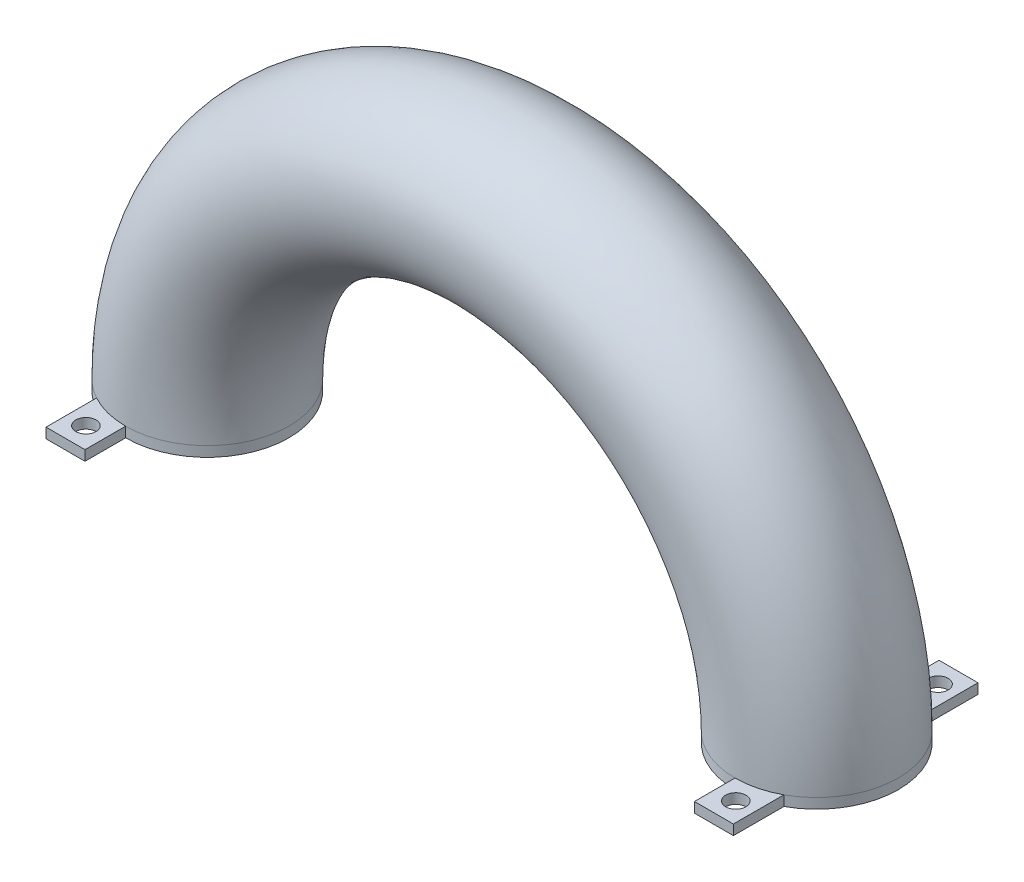
ISO-10303-21;
HEADER;
FILE_DESCRIPTION(('STEP AP214'),'2;1');
FILE_NAME('part.step','',(''),(''),'','','');
FILE_SCHEMA(('AUTOMOTIVE_DESIGN { 1 0 10303 214 1 1 1 1 }'));
ENDSEC;
DATA;
#1=APPLICATION_CONTEXT('core data for automotive mechanical design processes');
#2=APPLICATION_PROTOCOL_DEFINITION('international standard','automotive_design',2000,#1);
#3=PRODUCT_CONTEXT('',#1,'mechanical');
#4=PRODUCT('Part','Part','',(#3));
#5=PRODUCT_RELATED_PRODUCT_CATEGORY('part','',(#4));
#6=PRODUCT_DEFINITION_FORMATION('','',#4);
#7=PRODUCT_DEFINITION_CONTEXT('part definition',#1,'design');
#8=PRODUCT_DEFINITION('design','',#6,#7);
#9=PRODUCT_DEFINITION_SHAPE('','',#8);
#10=(LENGTH_UNIT() NAMED_UNIT(*) SI_UNIT(.MILLI.,.METRE.));
#11=(NAMED_UNIT(*) PLANE_ANGLE_UNIT() SI_UNIT($,.RADIAN.));
#12=(NAMED_UNIT(*) SI_UNIT($,.STERADIAN.) SOLID_ANGLE_UNIT());
#13=UNCERTAINTY_MEASURE_WITH_UNIT(LENGTH_MEASURE(1.E-05),#10,'distance_accuracy_value','');
#14=(GEOMETRIC_REPRESENTATION_CONTEXT(3) GLOBAL_UNCERTAINTY_ASSIGNED_CONTEXT((#13)) GLOBAL_UNIT_ASSIGNED_CONTEXT((#10,
#11,#12)) REPRESENTATION_CONTEXT('',''));
#15=CARTESIAN_POINT('',(0.,0.,0.));
#16=DIRECTION('',(0.,0.,1.));
#17=DIRECTION('',(1.,0.,0.));
#18=AXIS2_PLACEMENT_3D('',#15,#16,#17);
#19=CARTESIAN_POINT('',(0.,0.,0.));
#20=DIRECTION('',(0.,0.,1.));
#21=DIRECTION('',(1.,0.,0.));
#22=AXIS2_PLACEMENT_3D('',#19,#20,#21);
#23=TOROIDAL_SURFACE('',#22,60.25,16.15);
#24=CARTESIAN_POINT('',(-60.25,0.,0.));
#25=DIRECTION('',(0.,-1.,0.));
#26=DIRECTION('',(0.,0.,1.));
#27=AXIS2_PLACEMENT_3D('',#24,#25,#26);
#28=CIRCLE('',#27,16.15);
#29=CARTESIAN_POINT('',(-60.25,0.,16.15));
#30=VERTEX_POINT('',#29);
#31=CARTESIAN_POINT('',(-67.9596595843117,0.,14.1909706889286));
#32=VERTEX_POINT('',#31);
#33=EDGE_CURVE('E253',#30,#32,#28,.T.);
#34=ORIENTED_EDGE('',*,*,#33,.F.);
#35=CARTESIAN_POINT('',(-60.25,0.,0.));
#36=DIRECTION('',(0.,-1.,0.));
#37=DIRECTION('',(1.,0.,0.));
#38=AXIS2_PLACEMENT_3D('',#35,#36,#37);
#39=CIRCLE('',#38,16.15);
#40=CARTESIAN_POINT('',(-60.25,0.,-16.15));
#41=VERTEX_POINT('',#40);
#42=EDGE_CURVE('E131',#41,#30,#39,.T.);
#43=ORIENTED_EDGE('',*,*,#42,.F.);
#44=CARTESIAN_POINT('',(-60.25,0.,0.));
#45=DIRECTION('',(0.,-1.,0.));
#46=DIRECTION('',(1.,0.,0.));
#47=AXIS2_PLACEMENT_3D('',#44,#45,#46);
#48=CIRCLE('',#47,16.15);
#49=CARTESIAN_POINT('',(-67.9596595843117,0.,-14.1909706889286));
#50=VERTEX_POINT('',#49);
#51=EDGE_CURVE('E254',#41,#50,#48,.F.);
#52=ORIENTED_EDGE('',*,*,#51,.T.);
#53=EDGE_CURVE('E263',#32,#50,#39,.T.);
#54=ORIENTED_EDGE('',*,*,#53,.F.);
#55=EDGE_LOOP('',(#34,#43,#52,#54));
#56=FACE_BOUND('',#55,.T.);
#57=CARTESIAN_POINT('',(60.25,0.,0.));
#58=DIRECTION('',(0.,1.,0.));
#59=DIRECTION('',(0.,0.,1.));
#60=AXIS2_PLACEMENT_3D('',#57,#58,#59);
#61=CIRCLE('',#60,16.15);
#62=CARTESIAN_POINT('',(60.25,0.,16.15));
#63=VERTEX_POINT('',#62);
#64=CARTESIAN_POINT('',(67.9596595843117,0.,14.1909706889286));
#65=VERTEX_POINT('',#64);
#66=EDGE_CURVE('E110',#63,#65,#61,.T.);
#67=ORIENTED_EDGE('',*,*,#66,.T.);
#68=CARTESIAN_POINT('',(60.25,0.,0.));
#69=DIRECTION('',(0.,1.,0.));
#70=DIRECTION('',(-1.,0.,0.));
#71=AXIS2_PLACEMENT_3D('',#68,#69,#70);
#72=CIRCLE('',#71,16.15);
#73=CARTESIAN_POINT('',(67.9596595843117,0.,-14.1909706889286));
#74=VERTEX_POINT('',#73);
#75=EDGE_CURVE('E244',#65,#74,#72,.T.);
#76=ORIENTED_EDGE('',*,*,#75,.T.);
#77=CARTESIAN_POINT('',(60.25,0.,0.));
#78=DIRECTION('',(0.,-1.,0.));
#79=DIRECTION('',(1.,0.,0.));
#80=AXIS2_PLACEMENT_3D('',#77,#78,#79);
#81=CIRCLE('',#80,16.15);
#82=CARTESIAN_POINT('',(60.25,0.,-16.15));
#83=VERTEX_POINT('',#82);
#84=EDGE_CURVE('E425',#74,#83,#81,.F.);
#85=ORIENTED_EDGE('',*,*,#84,.T.);
#86=EDGE_CURVE('E249',#83,#63,#72,.T.);
#87=ORIENTED_EDGE('',*,*,#86,.T.);
#88=EDGE_LOOP('',(#67,#76,#85,#87));
#89=FACE_BOUND('',#88,.T.);
#90=ADVANCED_FACE('F107',(#56,#89),#23,.T.);
#91=CARTESIAN_POINT('',(0.,0.,0.));
#92=DIRECTION('',(0.,0.,1.));
#93=DIRECTION('',(1.,0.,0.));
#94=AXIS2_PLACEMENT_3D('',#91,#92,#93);
#95=TOROIDAL_SURFACE('',#94,60.25,14.15);
#96=CARTESIAN_POINT('',(60.25,0.,0.));
#97=DIRECTION('',(0.,1.,0.));
#98=DIRECTION('',(0.,0.,1.));
#99=AXIS2_PLACEMENT_3D('',#96,#97,#98);
#100=CIRCLE('',#99,14.15);
#101=CARTESIAN_POINT('',(74.4,0.,0.));
#102=VERTEX_POINT('',#101);
#103=EDGE_CURVE('E115',#102,#102,#100,.F.);
#104=CARTESIAN_POINT('',(-60.25,0.,0.));
#105=DIRECTION('',(0.,-1.,0.));
#106=DIRECTION('',(0.,0.,1.));
#107=AXIS2_PLACEMENT_3D('',#104,#105,#106);
#108=CIRCLE('',#107,14.15);
#109=CARTESIAN_POINT('',(-74.4,0.,0.));
#110=VERTEX_POINT('',#109);
#111=EDGE_CURVE('E12',#110,#110,#108,.F.);
#112=CARTESIAN_POINT('',(0.,0.,0.));
#113=DIRECTION('',(0.,0.,1.));
#114=DIRECTION('',(1.,0.,0.));
#115=AXIS2_PLACEMENT_3D('',#112,#113,#114);
#116=CIRCLE('',#115,74.4);
#117=EDGE_CURVE('',#102,#110,#116,.T.);
#118=ORIENTED_EDGE('',*,*,#103,.T.);
#119=ORIENTED_EDGE('',*,*,#111,.F.);
#120=ORIENTED_EDGE('',*,*,#117,.T.);
#121=ORIENTED_EDGE('',*,*,#117,.F.);
#122=EDGE_LOOP('',(#118,#120,#119,#121));
#123=FACE_BOUND('',#122,.T.);
#124=ADVANCED_FACE('F268',(#123),#95,.F.);
#125=CARTESIAN_POINT('',(0.,0.,0.));
#126=DIRECTION('',(0.,-1.,0.));
#127=DIRECTION('',(1.,0.,0.));
#128=AXIS2_PLACEMENT_3D('',#125,#126,#127);
#129=PLANE('',#128);
#130=ORIENTED_EDGE('',*,*,#51,.F.);
#131=DIRECTION('',(0.,0.,-1.));
#132=VECTOR('',#131,1.);
#133=CARTESIAN_POINT('',(-60.25,0.,0.));
#134=LINE('',#133,#132);
#135=CARTESIAN_POINT('',(-60.25,0.,-24.1836955760806));
#136=VERTEX_POINT('',#135);
#137=EDGE_CURVE('E432',#41,#136,#134,.T.);
#138=ORIENTED_EDGE('',*,*,#137,.T.);
#139=DIRECTION('',(-1.,0.,0.));
#140=VECTOR('',#139,1.);
#141=CARTESIAN_POINT('',(0.,0.,-24.1836955760806));
#142=LINE('',#141,#140);
#143=CARTESIAN_POINT('',(-67.9596595843117,0.,-24.1836955760806));
#144=VERTEX_POINT('',#143);
#145=EDGE_CURVE('E448',#136,#144,#142,.T.);
#146=ORIENTED_EDGE('',*,*,#145,.T.);
#147=DIRECTION('',(0.,0.,-1.));
#148=VECTOR('',#147,1.);
#149=CARTESIAN_POINT('',(-67.9596595843117,0.,0.));
#150=LINE('',#149,#148);
#151=EDGE_CURVE('E444',#50,#144,#150,.T.);
#152=ORIENTED_EDGE('',*,*,#151,.F.);
#153=EDGE_LOOP('',(#130,#138,#146,#152));
#154=FACE_BOUND('',#153,.T.);
#155=CARTESIAN_POINT('',(-64.25,0.,-20.));
#156=DIRECTION('',(0.,-1.,0.));
#157=DIRECTION('',(1.,0.,0.));
#158=AXIS2_PLACEMENT_3D('',#155,#156,#157);
#159=CIRCLE('',#158,2.);
#160=CARTESIAN_POINT('',(-62.25,0.,-20.));
#161=VERTEX_POINT('',#160);
#162=EDGE_CURVE('E441',#161,#161,#159,.T.);
#163=ORIENTED_EDGE('',*,*,#162,.T.);
#164=EDGE_LOOP('',(#163));
#165=FACE_BOUND('',#164,.T.);
#166=ADVANCED_FACE('F282',(#154,#165),#129,.F.);
#167=CARTESIAN_POINT('',(-67.9596595843117,-2.,0.));
#168=DIRECTION('',(1.,0.,0.));
#169=DIRECTION('',(0.,1.,0.));
#170=AXIS2_PLACEMENT_3D('',#167,#168,#169);
#171=PLANE('',#170);
#172=ORIENTED_EDGE('',*,*,#151,.T.);
#173=DIRECTION('',(0.,1.,0.));
#174=VECTOR('',#173,1.);
#175=CARTESIAN_POINT('',(-67.9596595843117,-2.,-24.1836955760806));
#176=LINE('',#175,#174);
#177=CARTESIAN_POINT('',(-67.9596595843117,-2.,-24.1836955760806));
#178=VERTEX_POINT('',#177);
#179=EDGE_CURVE('E259',#178,#144,#176,.T.);
#180=ORIENTED_EDGE('',*,*,#179,.F.);
#181=DIRECTION('',(0.,0.,-1.));
#182=VECTOR('',#181,1.);
#183=CARTESIAN_POINT('',(-67.9596595843117,-2.,0.));
#184=LINE('',#183,#182);
#185=CARTESIAN_POINT('',(-67.9596595843117,-2.,-14.1909706889286));
#186=VERTEX_POINT('',#185);
#187=EDGE_CURVE('E431',#186,#178,#184,.T.);
#188=ORIENTED_EDGE('',*,*,#187,.F.);
#189=DIRECTION('',(0.,1.,0.));
#190=VECTOR('',#189,1.);
#191=CARTESIAN_POINT('',(-67.9596595843117,-2.,-14.1909706889286));
#192=LINE('',#191,#190);
#193=EDGE_CURVE('E256',#186,#50,#192,.T.);
#194=ORIENTED_EDGE('',*,*,#193,.T.);
#195=EDGE_LOOP('',(#172,#180,#188,#194));
#196=FACE_BOUND('',#195,.T.);
#197=ADVANCED_FACE('F288',(#196),#171,.F.);
#198=CARTESIAN_POINT('',(0.,-2.00000000000001,-24.1836955760806));
#199=DIRECTION('',(0.,0.,-1.));
#200=DIRECTION('',(-1.,0.,0.));
#201=AXIS2_PLACEMENT_3D('',#198,#199,#200);
#202=PLANE('',#201);
#203=ORIENTED_EDGE('',*,*,#145,.F.);
#204=DIRECTION('',(0.,1.,0.));
#205=VECTOR('',#204,1.);
#206=CARTESIAN_POINT('',(-60.25,-2.,-24.1836955760806));
#207=LINE('',#206,#205);
#208=CARTESIAN_POINT('',(-60.25,-2.,-24.1836955760806));
#209=VERTEX_POINT('',#208);
#210=EDGE_CURVE('E455',#209,#136,#207,.T.);
#211=ORIENTED_EDGE('',*,*,#210,.F.);
#212=DIRECTION('',(-1.,0.,0.));
#213=VECTOR('',#212,1.);
#214=CARTESIAN_POINT('',(0.,-2.00000000000001,-24.1836955760806));
#215=LINE('',#214,#213);
#216=EDGE_CURVE('E434',#209,#178,#215,.T.);
#217=ORIENTED_EDGE('',*,*,#216,.T.);
#218=ORIENTED_EDGE('',*,*,#179,.T.);
#219=EDGE_LOOP('',(#203,#211,#217,#218));
#220=FACE_BOUND('',#219,.T.);
#221=ADVANCED_FACE('F328',(#220),#202,.T.);
#222=CARTESIAN_POINT('',(-60.25,-2.,0.));
#223=DIRECTION('',(1.,0.,0.));
#224=DIRECTION('',(0.,1.,0.));
#225=AXIS2_PLACEMENT_3D('',#222,#223,#224);
#226=PLANE('',#225);
#227=ORIENTED_EDGE('',*,*,#137,.F.);
#228=DIRECTION('',(0.,1.,0.));
#229=VECTOR('',#228,1.);
#230=CARTESIAN_POINT('',(-60.25,-2.,-16.15));
#231=LINE('',#230,#229);
#232=CARTESIAN_POINT('',(-60.25,-2.,-16.15));
#233=VERTEX_POINT('',#232);
#234=EDGE_CURVE('E440',#233,#41,#231,.T.);
#235=ORIENTED_EDGE('',*,*,#234,.F.);
#236=DIRECTION('',(0.,0.,-1.));
#237=VECTOR('',#236,1.);
#238=CARTESIAN_POINT('',(-60.25,-2.,0.));
#239=LINE('',#238,#237);
#240=EDGE_CURVE('E437',#233,#209,#239,.T.);
#241=ORIENTED_EDGE('',*,*,#240,.T.);
#242=ORIENTED_EDGE('',*,*,#210,.T.);
#243=EDGE_LOOP('',(#227,#235,#241,#242));
#244=FACE_BOUND('',#243,.T.);
#245=ADVANCED_FACE('F324',(#244),#226,.T.);
#246=CARTESIAN_POINT('',(-64.25,-2.,-20.));
#247=DIRECTION('',(0.,1.,0.));
#248=DIRECTION('',(-1.,0.,0.));
#249=AXIS2_PLACEMENT_3D('',#246,#247,#248);
#250=CYLINDRICAL_SURFACE('',#249,2.);
#251=CARTESIAN_POINT('',(-64.25,-2.,-20.));
#252=DIRECTION('',(0.,-1.,0.));
#253=DIRECTION('',(1.,0.,0.));
#254=AXIS2_PLACEMENT_3D('',#251,#252,#253);
#255=CIRCLE('',#254,2.);
#256=CARTESIAN_POINT('',(-62.25,-2.,-20.));
#257=VERTEX_POINT('',#256);
#258=EDGE_CURVE('E428',#257,#257,#255,.T.);
#259=ORIENTED_EDGE('',*,*,#258,.T.);
#260=EDGE_LOOP('',(#259));
#261=FACE_BOUND('',#260,.T.);
#262=ORIENTED_EDGE('',*,*,#162,.F.);
#263=EDGE_LOOP('',(#262));
#264=FACE_BOUND('',#263,.T.);
#265=ADVANCED_FACE('F321',(#261,#264),#250,.F.);
#266=ORIENTED_EDGE('',*,*,#33,.T.);
#267=DIRECTION('',(0.,0.,1.));
#268=VECTOR('',#267,1.);
#269=CARTESIAN_POINT('',(-67.9596595843117,0.,0.));
#270=LINE('',#269,#268);
#271=CARTESIAN_POINT('',(-67.9596595843117,0.,24.1836955760806));
#272=VERTEX_POINT('',#271);
#273=EDGE_CURVE('E462',#32,#272,#270,.T.);
#274=ORIENTED_EDGE('',*,*,#273,.T.);
#275=DIRECTION('',(-1.,0.,0.));
#276=VECTOR('',#275,1.);
#277=CARTESIAN_POINT('',(0.,0.,24.1836955760806));
#278=LINE('',#277,#276);
#279=CARTESIAN_POINT('',(-60.25,0.,24.1836955760806));
#280=VERTEX_POINT('',#279);
#281=EDGE_CURVE('E478',#280,#272,#278,.T.);
#282=ORIENTED_EDGE('',*,*,#281,.F.);
#283=DIRECTION('',(0.,0.,1.));
#284=VECTOR('',#283,1.);
#285=CARTESIAN_POINT('',(-60.25,0.,0.));
#286=LINE('',#285,#284);
#287=EDGE_CURVE('E474',#30,#280,#286,.T.);
#288=ORIENTED_EDGE('',*,*,#287,.F.);
#289=EDGE_LOOP('',(#266,#274,#282,#288));
#290=FACE_BOUND('',#289,.T.);
#291=CARTESIAN_POINT('',(-64.25,0.,20.));
#292=DIRECTION('',(0.,-1.,0.));
#293=DIRECTION('',(1.,0.,0.));
#294=AXIS2_PLACEMENT_3D('',#291,#292,#293);
#295=CIRCLE('',#294,2.);
#296=CARTESIAN_POINT('',(-62.25,0.,20.));
#297=VERTEX_POINT('',#296);
#298=EDGE_CURVE('E471',#297,#297,#295,.T.);
#299=ORIENTED_EDGE('',*,*,#298,.T.);
#300=EDGE_LOOP('',(#299));
#301=FACE_BOUND('',#300,.T.);
#302=ADVANCED_FACE('F291',(#290,#301),#129,.F.);
#303=CARTESIAN_POINT('',(0.,-2.00000000000001,0.));
#304=DIRECTION('',(0.,-1.,0.));
#305=DIRECTION('',(1.,0.,0.));
#306=AXIS2_PLACEMENT_3D('',#303,#304,#305);
#307=PLANE('',#306);
#308=ORIENTED_EDGE('',*,*,#258,.F.);
#309=EDGE_LOOP('',(#308));
#310=FACE_BOUND('',#309,.T.);
#311=ORIENTED_EDGE('',*,*,#240,.F.);
#312=CARTESIAN_POINT('',(-60.25,-2.,0.));
#313=DIRECTION('',(0.,-1.,0.));
#314=DIRECTION('',(1.,0.,0.));
#315=AXIS2_PLACEMENT_3D('',#312,#313,#314);
#316=CIRCLE('',#315,16.15);
#317=CARTESIAN_POINT('',(-60.25,-2.,16.15));
#318=VERTEX_POINT('',#317);
#319=EDGE_CURVE('E494',#233,#318,#316,.T.);
#320=ORIENTED_EDGE('',*,*,#319,.T.);
#321=DIRECTION('',(0.,0.,1.));
#322=VECTOR('',#321,1.);
#323=CARTESIAN_POINT('',(-60.25,-2.,0.));
#324=LINE('',#323,#322);
#325=CARTESIAN_POINT('',(-60.25,-2.,24.1836955760806));
#326=VERTEX_POINT('',#325);
#327=EDGE_CURVE('E461',#318,#326,#324,.T.);
#328=ORIENTED_EDGE('',*,*,#327,.T.);
#329=DIRECTION('',(-1.,0.,0.));
#330=VECTOR('',#329,1.);
#331=CARTESIAN_POINT('',(0.,-2.00000000000001,24.1836955760806));
#332=LINE('',#331,#330);
#333=CARTESIAN_POINT('',(-67.9596595843117,-2.,24.1836955760806));
#334=VERTEX_POINT('',#333);
#335=EDGE_CURVE('E465',#326,#334,#332,.T.);
#336=ORIENTED_EDGE('',*,*,#335,.T.);
#337=DIRECTION('',(0.,0.,1.));
#338=VECTOR('',#337,1.);
#339=CARTESIAN_POINT('',(-67.9596595843117,-2.,0.));
#340=LINE('',#339,#338);
#341=CARTESIAN_POINT('',(-67.9596595843117,-2.,14.1909706889286));
#342=VERTEX_POINT('',#341);
#343=EDGE_CURVE('E467',#342,#334,#340,.T.);
#344=ORIENTED_EDGE('',*,*,#343,.F.);
#345=EDGE_CURVE('E475',#342,#186,#316,.T.);
#346=ORIENTED_EDGE('',*,*,#345,.T.);
#347=ORIENTED_EDGE('',*,*,#187,.T.);
#348=ORIENTED_EDGE('',*,*,#216,.F.);
#349=EDGE_LOOP('',(#311,#320,#328,#336,#344,#346,#347,#348));
#350=FACE_BOUND('',#349,.T.);
#351=CARTESIAN_POINT('',(-60.25,-2.,0.));
#352=DIRECTION('',(0.,-1.,0.));
#353=DIRECTION('',(1.,0.,0.));
#354=AXIS2_PLACEMENT_3D('',#351,#352,#353);
#355=CIRCLE('',#354,14.15);
#356=CARTESIAN_POINT('',(-46.1,-2.,0.));
#357=VERTEX_POINT('',#356);
#358=EDGE_CURVE('E427',#357,#357,#355,.T.);
#359=ORIENTED_EDGE('',*,*,#358,.F.);
#360=EDGE_LOOP('',(#359));
#361=FACE_BOUND('',#360,.T.);
#362=CARTESIAN_POINT('',(-64.25,-2.,20.));
#363=DIRECTION('',(0.,-1.,0.));
#364=DIRECTION('',(1.,0.,0.));
#365=AXIS2_PLACEMENT_3D('',#362,#363,#364);
#366=CIRCLE('',#365,2.);
#367=CARTESIAN_POINT('',(-62.25,-2.,20.));
#368=VERTEX_POINT('',#367);
#369=EDGE_CURVE('E458',#368,#368,#366,.T.);
#370=ORIENTED_EDGE('',*,*,#369,.F.);
#371=EDGE_LOOP('',(#370));
#372=FACE_BOUND('',#371,.T.);
#373=ADVANCED_FACE('F316',(#310,#350,#361,#372),#307,.T.);
#374=CARTESIAN_POINT('',(0.,-2.00000000000001,24.1836955760806));
#375=DIRECTION('',(0.,0.,-1.));
#376=DIRECTION('',(-1.,0.,0.));
#377=AXIS2_PLACEMENT_3D('',#374,#375,#376);
#378=PLANE('',#377);
#379=ORIENTED_EDGE('',*,*,#281,.T.);
#380=DIRECTION('',(0.,1.,0.));
#381=VECTOR('',#380,1.);
#382=CARTESIAN_POINT('',(-67.9596595843117,-2.,24.1836955760806));
#383=LINE('',#382,#381);
#384=EDGE_CURVE('E485',#334,#272,#383,.T.);
#385=ORIENTED_EDGE('',*,*,#384,.F.);
#386=ORIENTED_EDGE('',*,*,#335,.F.);
#387=DIRECTION('',(0.,1.,0.));
#388=VECTOR('',#387,1.);
#389=CARTESIAN_POINT('',(-60.25,-2.,24.1836955760806));
#390=LINE('',#389,#388);
#391=EDGE_CURVE('E487',#326,#280,#390,.T.);
#392=ORIENTED_EDGE('',*,*,#391,.T.);
#393=EDGE_LOOP('',(#379,#385,#386,#392));
#394=FACE_BOUND('',#393,.T.);
#395=ADVANCED_FACE('F309',(#394),#378,.F.);
#396=CARTESIAN_POINT('',(-64.25,-2.,20.));
#397=DIRECTION('',(0.,1.,0.));
#398=DIRECTION('',(-1.,0.,0.));
#399=AXIS2_PLACEMENT_3D('',#396,#397,#398);
#400=CYLINDRICAL_SURFACE('',#399,2.);
#401=ORIENTED_EDGE('',*,*,#369,.T.);
#402=EDGE_LOOP('',(#401));
#403=FACE_BOUND('',#402,.T.);
#404=ORIENTED_EDGE('',*,*,#298,.F.);
#405=EDGE_LOOP('',(#404));
#406=FACE_BOUND('',#405,.T.);
#407=ADVANCED_FACE('F301',(#403,#406),#400,.F.);
#408=CARTESIAN_POINT('',(-67.9596595843117,-2.,0.));
#409=DIRECTION('',(-1.,0.,0.));
#410=DIRECTION('',(0.,-1.,0.));
#411=AXIS2_PLACEMENT_3D('',#408,#409,#410);
#412=PLANE('',#411);
#413=ORIENTED_EDGE('',*,*,#273,.F.);
#414=DIRECTION('',(0.,1.,0.));
#415=VECTOR('',#414,1.);
#416=CARTESIAN_POINT('',(-67.9596595843117,-2.,14.1909706889286));
#417=LINE('',#416,#415);
#418=EDGE_CURVE('E470',#342,#32,#417,.T.);
#419=ORIENTED_EDGE('',*,*,#418,.F.);
#420=ORIENTED_EDGE('',*,*,#343,.T.);
#421=ORIENTED_EDGE('',*,*,#384,.T.);
#422=EDGE_LOOP('',(#413,#419,#420,#421));
#423=FACE_BOUND('',#422,.T.);
#424=ADVANCED_FACE('F308',(#423),#412,.T.);
#425=CARTESIAN_POINT('',(-60.25,-2.,0.));
#426=DIRECTION('',(-1.,0.,0.));
#427=DIRECTION('',(0.,-1.,0.));
#428=AXIS2_PLACEMENT_3D('',#425,#426,#427);
#429=PLANE('',#428);
#430=ORIENTED_EDGE('',*,*,#287,.T.);
#431=ORIENTED_EDGE('',*,*,#391,.F.);
#432=ORIENTED_EDGE('',*,*,#327,.F.);
#433=DIRECTION('',(0.,1.,0.));
#434=VECTOR('',#433,1.);
#435=CARTESIAN_POINT('',(-60.25,-2.,16.15));
#436=LINE('',#435,#434);
#437=EDGE_CURVE('E445',#318,#30,#436,.T.);
#438=ORIENTED_EDGE('',*,*,#437,.T.);
#439=EDGE_LOOP('',(#430,#431,#432,#438));
#440=FACE_BOUND('',#439,.T.);
#441=ADVANCED_FACE('F304',(#440),#429,.F.);
#442=CARTESIAN_POINT('',(-60.25,-2.,0.));
#443=DIRECTION('',(0.,1.,0.));
#444=DIRECTION('',(-1.,0.,0.));
#445=AXIS2_PLACEMENT_3D('',#442,#443,#444);
#446=CYLINDRICAL_SURFACE('',#445,14.15);
#447=ORIENTED_EDGE('',*,*,#358,.T.);
#448=EDGE_LOOP('',(#447));
#449=FACE_BOUND('',#448,.T.);
#450=ORIENTED_EDGE('',*,*,#111,.T.);
#451=EDGE_LOOP('',(#450));
#452=FACE_BOUND('',#451,.T.);
#453=ADVANCED_FACE('F300',(#449,#452),#446,.F.);
#454=CARTESIAN_POINT('',(-60.25,-2.,0.));
#455=DIRECTION('',(0.,1.,0.));
#456=DIRECTION('',(-1.,0.,0.));
#457=AXIS2_PLACEMENT_3D('',#454,#455,#456);
#458=CYLINDRICAL_SURFACE('',#457,16.15);
#459=ORIENTED_EDGE('',*,*,#53,.T.);
#460=ORIENTED_EDGE('',*,*,#193,.F.);
#461=ORIENTED_EDGE('',*,*,#345,.F.);
#462=ORIENTED_EDGE('',*,*,#418,.T.);
#463=EDGE_LOOP('',(#459,#460,#461,#462));
#464=FACE_BOUND('',#463,.T.);
#465=ADVANCED_FACE('F298',(#464),#458,.T.);
#466=ORIENTED_EDGE('',*,*,#234,.T.);
#467=ORIENTED_EDGE('',*,*,#42,.T.);
#468=ORIENTED_EDGE('',*,*,#437,.F.);
#469=ORIENTED_EDGE('',*,*,#319,.F.);
#470=EDGE_LOOP('',(#466,#467,#468,#469));
#471=FACE_BOUND('',#470,.T.);
#472=ADVANCED_FACE('F294',(#471),#458,.T.);
#473=CARTESIAN_POINT('',(0.,0.,0.));
#474=DIRECTION('',(0.,-1.,0.));
#475=DIRECTION('',(-1.,0.,0.));
#476=AXIS2_PLACEMENT_3D('',#473,#474,#475);
#477=PLANE('',#476);
#478=ORIENTED_EDGE('',*,*,#84,.F.);
#479=DIRECTION('',(0.,0.,-1.));
#480=VECTOR('',#479,1.);
#481=CARTESIAN_POINT('',(67.9596595843117,0.,0.));
#482=LINE('',#481,#480);
#483=CARTESIAN_POINT('',(67.9596595843117,0.,-24.1836955760806));
#484=VERTEX_POINT('',#483);
#485=EDGE_CURVE('E401',#74,#484,#482,.T.);
#486=ORIENTED_EDGE('',*,*,#485,.T.);
#487=DIRECTION('',(1.,0.,0.));
#488=VECTOR('',#487,1.);
#489=CARTESIAN_POINT('',(0.,0.,-24.1836955760806));
#490=LINE('',#489,#488);
#491=CARTESIAN_POINT('',(60.25,0.,-24.1836955760806));
#492=VERTEX_POINT('',#491);
#493=EDGE_CURVE('E412',#492,#484,#490,.T.);
#494=ORIENTED_EDGE('',*,*,#493,.F.);
#495=DIRECTION('',(0.,0.,-1.));
#496=VECTOR('',#495,1.);
#497=CARTESIAN_POINT('',(60.25,0.,0.));
#498=LINE('',#497,#496);
#499=EDGE_CURVE('E410',#83,#492,#498,.T.);
#500=ORIENTED_EDGE('',*,*,#499,.F.);
#501=EDGE_LOOP('',(#478,#486,#494,#500));
#502=FACE_BOUND('',#501,.T.);
#503=CARTESIAN_POINT('',(64.25,0.,-20.));
#504=DIRECTION('',(0.,1.,0.));
#505=DIRECTION('',(-1.,0.,0.));
#506=AXIS2_PLACEMENT_3D('',#503,#504,#505);
#507=CIRCLE('',#506,2.);
#508=CARTESIAN_POINT('',(62.25,0.,-20.));
#509=VERTEX_POINT('',#508);
#510=EDGE_CURVE('E230',#509,#509,#507,.T.);
#511=ORIENTED_EDGE('',*,*,#510,.F.);
#512=EDGE_LOOP('',(#511));
#513=FACE_BOUND('',#512,.T.);
#514=ADVANCED_FACE('F297',(#502,#513),#477,.F.);
#515=CARTESIAN_POINT('',(60.25,-2.,0.));
#516=DIRECTION('',(1.,0.,0.));
#517=DIRECTION('',(0.,1.,0.));
#518=AXIS2_PLACEMENT_3D('',#515,#516,#517);
#519=PLANE('',#518);
#520=ORIENTED_EDGE('',*,*,#499,.T.);
#521=DIRECTION('',(0.,1.,0.));
#522=VECTOR('',#521,1.);
#523=CARTESIAN_POINT('',(60.25,-2.,-24.1836955760806));
#524=LINE('',#523,#522);
#525=CARTESIAN_POINT('',(60.25,-2.,-24.1836955760806));
#526=VERTEX_POINT('',#525);
#527=EDGE_CURVE('E420',#526,#492,#524,.T.);
#528=ORIENTED_EDGE('',*,*,#527,.F.);
#529=DIRECTION('',(0.,0.,-1.));
#530=VECTOR('',#529,1.);
#531=CARTESIAN_POINT('',(60.25,-2.,0.));
#532=LINE('',#531,#530);
#533=CARTESIAN_POINT('',(60.25,-2.,-16.15));
#534=VERTEX_POINT('',#533);
#535=EDGE_CURVE('E400',#534,#526,#532,.T.);
#536=ORIENTED_EDGE('',*,*,#535,.F.);
#537=DIRECTION('',(0.,1.,0.));
#538=VECTOR('',#537,1.);
#539=CARTESIAN_POINT('',(60.25,-2.,-16.15));
#540=LINE('',#539,#538);
#541=EDGE_CURVE('E423',#534,#83,#540,.T.);
#542=ORIENTED_EDGE('',*,*,#541,.T.);
#543=EDGE_LOOP('',(#520,#528,#536,#542));
#544=FACE_BOUND('',#543,.T.);
#545=ADVANCED_FACE('F347',(#544),#519,.F.);
#546=CARTESIAN_POINT('',(0.,-2.00000000000001,-24.1836955760806));
#547=DIRECTION('',(0.,0.,1.));
#548=DIRECTION('',(1.,0.,0.));
#549=AXIS2_PLACEMENT_3D('',#546,#547,#548);
#550=PLANE('',#549);
#551=ORIENTED_EDGE('',*,*,#493,.T.);
#552=DIRECTION('',(0.,1.,0.));
#553=VECTOR('',#552,1.);
#554=CARTESIAN_POINT('',(67.9596595843117,-2.,-24.1836955760806));
#555=LINE('',#554,#553);
#556=CARTESIAN_POINT('',(67.9596595843117,-2.,-24.1836955760806));
#557=VERTEX_POINT('',#556);
#558=EDGE_CURVE('E418',#557,#484,#555,.T.);
#559=ORIENTED_EDGE('',*,*,#558,.F.);
#560=DIRECTION('',(1.,0.,0.));
#561=VECTOR('',#560,1.);
#562=CARTESIAN_POINT('',(0.,-2.00000000000001,-24.1836955760806));
#563=LINE('',#562,#561);
#564=EDGE_CURVE('E403',#526,#557,#563,.T.);
#565=ORIENTED_EDGE('',*,*,#564,.F.);
#566=ORIENTED_EDGE('',*,*,#527,.T.);
#567=EDGE_LOOP('',(#551,#559,#565,#566));
#568=FACE_BOUND('',#567,.T.);
#569=ADVANCED_FACE('F345',(#568),#550,.F.);
#570=CARTESIAN_POINT('',(64.25,-2.,-20.));
#571=DIRECTION('',(0.,1.,0.));
#572=DIRECTION('',(-1.,0.,0.));
#573=AXIS2_PLACEMENT_3D('',#570,#571,#572);
#574=CYLINDRICAL_SURFACE('',#573,2.);
#575=CARTESIAN_POINT('',(64.25,-2.,-20.));
#576=DIRECTION('',(0.,1.,0.));
#577=DIRECTION('',(-1.,0.,0.));
#578=AXIS2_PLACEMENT_3D('',#575,#576,#577);
#579=CIRCLE('',#578,2.);
#580=CARTESIAN_POINT('',(62.25,-2.,-20.));
#581=VERTEX_POINT('',#580);
#582=EDGE_CURVE('E397',#581,#581,#579,.T.);
#583=ORIENTED_EDGE('',*,*,#582,.F.);
#584=EDGE_LOOP('',(#583));
#585=FACE_BOUND('',#584,.T.);
#586=ORIENTED_EDGE('',*,*,#510,.T.);
#587=EDGE_LOOP('',(#586));
#588=FACE_BOUND('',#587,.T.);
#589=ADVANCED_FACE('F341',(#585,#588),#574,.F.);
#590=CARTESIAN_POINT('',(67.9596595843117,-2.,0.));
#591=DIRECTION('',(1.,0.,0.));
#592=DIRECTION('',(0.,1.,0.));
#593=AXIS2_PLACEMENT_3D('',#590,#591,#592);
#594=PLANE('',#593);
#595=ORIENTED_EDGE('',*,*,#485,.F.);
#596=DIRECTION('',(0.,1.,0.));
#597=VECTOR('',#596,1.);
#598=CARTESIAN_POINT('',(67.9596595843117,-2.,-14.1909706889286));
#599=LINE('',#598,#597);
#600=CARTESIAN_POINT('',(67.9596595843117,-2.,-14.1909706889286));
#601=VERTEX_POINT('',#600);
#602=EDGE_CURVE('E123',#601,#74,#599,.T.);
#603=ORIENTED_EDGE('',*,*,#602,.F.);
#604=DIRECTION('',(0.,0.,-1.));
#605=VECTOR('',#604,1.);
#606=CARTESIAN_POINT('',(67.9596595843117,-2.,0.));
#607=LINE('',#606,#605);
#608=EDGE_CURVE('E405',#601,#557,#607,.T.);
#609=ORIENTED_EDGE('',*,*,#608,.T.);
#610=ORIENTED_EDGE('',*,*,#558,.T.);
#611=EDGE_LOOP('',(#595,#603,#609,#610));
#612=FACE_BOUND('',#611,.T.);
#613=ADVANCED_FACE('F344',(#612),#594,.T.);
#614=CARTESIAN_POINT('',(0.,-2.00000000000001,0.));
#615=DIRECTION('',(0.,-1.,0.));
#616=DIRECTION('',(-1.,0.,0.));
#617=AXIS2_PLACEMENT_3D('',#614,#615,#616);
#618=PLANE('',#617);
#619=ORIENTED_EDGE('',*,*,#582,.T.);
#620=EDGE_LOOP('',(#619));
#621=FACE_BOUND('',#620,.T.);
#622=ORIENTED_EDGE('',*,*,#608,.F.);
#623=CARTESIAN_POINT('',(60.25,-2.,0.));
#624=DIRECTION('',(0.,1.,0.));
#625=DIRECTION('',(-1.,0.,0.));
#626=AXIS2_PLACEMENT_3D('',#623,#624,#625);
#627=CIRCLE('',#626,16.15);
#628=CARTESIAN_POINT('',(67.9596595843117,-2.,14.1909706889286));
#629=VERTEX_POINT('',#628);
#630=EDGE_CURVE('E732',#629,#601,#627,.T.);
#631=ORIENTED_EDGE('',*,*,#630,.F.);
#632=DIRECTION('',(0.,0.,1.));
#633=VECTOR('',#632,1.);
#634=CARTESIAN_POINT('',(67.9596595843117,-2.,0.));
#635=LINE('',#634,#633);
#636=CARTESIAN_POINT('',(67.9596595843117,-2.,24.1836955760806));
#637=VERTEX_POINT('',#636);
#638=EDGE_CURVE('E228',#629,#637,#635,.T.);
#639=ORIENTED_EDGE('',*,*,#638,.T.);
#640=DIRECTION('',(1.,0.,0.));
#641=VECTOR('',#640,1.);
#642=CARTESIAN_POINT('',(0.,-2.00000000000001,24.1836955760806));
#643=LINE('',#642,#641);
#644=CARTESIAN_POINT('',(60.25,-2.,24.1836955760806));
#645=VERTEX_POINT('',#644);
#646=EDGE_CURVE('E392',#645,#637,#643,.T.);
#647=ORIENTED_EDGE('',*,*,#646,.F.);
#648=DIRECTION('',(0.,0.,1.));
#649=VECTOR('',#648,1.);
#650=CARTESIAN_POINT('',(60.25,-2.,0.));
#651=LINE('',#650,#649);
#652=CARTESIAN_POINT('',(60.25,-2.,16.15));
#653=VERTEX_POINT('',#652);
#654=EDGE_CURVE('E389',#653,#645,#651,.T.);
#655=ORIENTED_EDGE('',*,*,#654,.F.);
#656=EDGE_CURVE('E248',#534,#653,#627,.T.);
#657=ORIENTED_EDGE('',*,*,#656,.F.);
#658=ORIENTED_EDGE('',*,*,#535,.T.);
#659=ORIENTED_EDGE('',*,*,#564,.T.);
#660=EDGE_LOOP('',(#622,#631,#639,#647,#655,#657,#658,#659));
#661=FACE_BOUND('',#660,.T.);
#662=CARTESIAN_POINT('',(64.25,-2.,20.));
#663=DIRECTION('',(0.,1.,0.));
#664=DIRECTION('',(-1.,0.,0.));
#665=AXIS2_PLACEMENT_3D('',#662,#663,#664);
#666=CIRCLE('',#665,2.);
#667=CARTESIAN_POINT('',(62.25,-2.,20.));
#668=VERTEX_POINT('',#667);
#669=EDGE_CURVE('E384',#668,#668,#666,.T.);
#670=ORIENTED_EDGE('',*,*,#669,.T.);
#671=EDGE_LOOP('',(#670));
#672=FACE_BOUND('',#671,.T.);
#673=CARTESIAN_POINT('',(60.25,-2.,0.));
#674=DIRECTION('',(0.,1.,0.));
#675=DIRECTION('',(-1.,0.,0.));
#676=AXIS2_PLACEMENT_3D('',#673,#674,#675);
#677=CIRCLE('',#676,14.15);
#678=CARTESIAN_POINT('',(46.1,-2.,0.));
#679=VERTEX_POINT('',#678);
#680=EDGE_CURVE('E735',#679,#679,#677,.T.);
#681=ORIENTED_EDGE('',*,*,#680,.T.);
#682=EDGE_LOOP('',(#681));
#683=FACE_BOUND('',#682,.T.);
#684=ADVANCED_FACE('F356',(#621,#661,#672,#683),#618,.T.);
#685=ORIENTED_EDGE('',*,*,#66,.F.);
#686=DIRECTION('',(0.,0.,1.));
#687=VECTOR('',#686,1.);
#688=CARTESIAN_POINT('',(60.25,0.,0.));
#689=LINE('',#688,#687);
#690=CARTESIAN_POINT('',(60.25,0.,24.1836955760806));
#691=VERTEX_POINT('',#690);
#692=EDGE_CURVE('E378',#63,#691,#689,.T.);
#693=ORIENTED_EDGE('',*,*,#692,.T.);
#694=DIRECTION('',(1.,0.,0.));
#695=VECTOR('',#694,1.);
#696=CARTESIAN_POINT('',(0.,0.,24.1836955760806));
#697=LINE('',#696,#695);
#698=CARTESIAN_POINT('',(67.9596595843117,0.,24.1836955760806));
#699=VERTEX_POINT('',#698);
#700=EDGE_CURVE('E240',#691,#699,#697,.T.);
#701=ORIENTED_EDGE('',*,*,#700,.T.);
#702=DIRECTION('',(0.,0.,1.));
#703=VECTOR('',#702,1.);
#704=CARTESIAN_POINT('',(67.9596595843117,0.,0.));
#705=LINE('',#704,#703);
#706=EDGE_CURVE('E226',#65,#699,#705,.T.);
#707=ORIENTED_EDGE('',*,*,#706,.F.);
#708=EDGE_LOOP('',(#685,#693,#701,#707));
#709=FACE_BOUND('',#708,.T.);
#710=CARTESIAN_POINT('',(64.25,0.,20.));
#711=DIRECTION('',(0.,1.,0.));
#712=DIRECTION('',(-1.,0.,0.));
#713=AXIS2_PLACEMENT_3D('',#710,#711,#712);
#714=CIRCLE('',#713,2.);
#715=CARTESIAN_POINT('',(62.25,0.,20.));
#716=VERTEX_POINT('',#715);
#717=EDGE_CURVE('E241',#716,#716,#714,.T.);
#718=ORIENTED_EDGE('',*,*,#717,.F.);
#719=EDGE_LOOP('',(#718));
#720=FACE_BOUND('',#719,.T.);
#721=ADVANCED_FACE('F234',(#709,#720),#477,.F.);
#722=CARTESIAN_POINT('',(60.25,-2.,0.));
#723=DIRECTION('',(0.,1.,0.));
#724=DIRECTION('',(-1.,0.,0.));
#725=AXIS2_PLACEMENT_3D('',#722,#723,#724);
#726=CYLINDRICAL_SURFACE('',#725,16.15);
#727=ORIENTED_EDGE('',*,*,#541,.F.);
#728=ORIENTED_EDGE('',*,*,#656,.T.);
#729=DIRECTION('',(0.,1.,0.));
#730=VECTOR('',#729,1.);
#731=CARTESIAN_POINT('',(60.25,-2.,16.15));
#732=LINE('',#731,#730);
#733=EDGE_CURVE('E381',#653,#63,#732,.T.);
#734=ORIENTED_EDGE('',*,*,#733,.T.);
#735=ORIENTED_EDGE('',*,*,#86,.F.);
#736=EDGE_LOOP('',(#727,#728,#734,#735));
#737=FACE_BOUND('',#736,.T.);
#738=ADVANCED_FACE('F279',(#737),#726,.T.);
#739=CARTESIAN_POINT('',(67.9596595843117,-2.,0.));
#740=DIRECTION('',(-1.,0.,0.));
#741=DIRECTION('',(0.,-1.,0.));
#742=AXIS2_PLACEMENT_3D('',#739,#740,#741);
#743=PLANE('',#742);
#744=ORIENTED_EDGE('',*,*,#706,.T.);
#745=DIRECTION('',(0.,1.,0.));
#746=VECTOR('',#745,1.);
#747=CARTESIAN_POINT('',(67.9596595843117,-2.,24.1836955760806));
#748=LINE('',#747,#746);
#749=EDGE_CURVE('E231',#637,#699,#748,.T.);
#750=ORIENTED_EDGE('',*,*,#749,.F.);
#751=ORIENTED_EDGE('',*,*,#638,.F.);
#752=DIRECTION('',(0.,1.,0.));
#753=VECTOR('',#752,1.);
#754=CARTESIAN_POINT('',(67.9596595843117,-2.,14.1909706889286));
#755=LINE('',#754,#753);
#756=EDGE_CURVE('E222',#629,#65,#755,.T.);
#757=ORIENTED_EDGE('',*,*,#756,.T.);
#758=EDGE_LOOP('',(#744,#750,#751,#757));
#759=FACE_BOUND('',#758,.T.);
#760=ADVANCED_FACE('F224',(#759),#743,.F.);
#761=CARTESIAN_POINT('',(0.,-2.00000000000001,24.1836955760806));
#762=DIRECTION('',(0.,0.,1.));
#763=DIRECTION('',(1.,0.,0.));
#764=AXIS2_PLACEMENT_3D('',#761,#762,#763);
#765=PLANE('',#764);
#766=ORIENTED_EDGE('',*,*,#700,.F.);
#767=DIRECTION('',(0.,1.,0.));
#768=VECTOR('',#767,1.);
#769=CARTESIAN_POINT('',(60.25,-2.,24.1836955760806));
#770=LINE('',#769,#768);
#771=EDGE_CURVE('E383',#645,#691,#770,.T.);
#772=ORIENTED_EDGE('',*,*,#771,.F.);
#773=ORIENTED_EDGE('',*,*,#646,.T.);
#774=ORIENTED_EDGE('',*,*,#749,.T.);
#775=EDGE_LOOP('',(#766,#772,#773,#774));
#776=FACE_BOUND('',#775,.T.);
#777=ADVANCED_FACE('F366',(#776),#765,.T.);
#778=CARTESIAN_POINT('',(64.25,-2.,20.));
#779=DIRECTION('',(0.,1.,0.));
#780=DIRECTION('',(-1.,0.,0.));
#781=AXIS2_PLACEMENT_3D('',#778,#779,#780);
#782=CYLINDRICAL_SURFACE('',#781,2.);
#783=ORIENTED_EDGE('',*,*,#669,.F.);
#784=EDGE_LOOP('',(#783));
#785=FACE_BOUND('',#784,.T.);
#786=ORIENTED_EDGE('',*,*,#717,.T.);
#787=EDGE_LOOP('',(#786));
#788=FACE_BOUND('',#787,.T.);
#789=ADVANCED_FACE('F363',(#785,#788),#782,.F.);
#790=CARTESIAN_POINT('',(60.25,-2.,0.));
#791=DIRECTION('',(-1.,0.,0.));
#792=DIRECTION('',(0.,-1.,0.));
#793=AXIS2_PLACEMENT_3D('',#790,#791,#792);
#794=PLANE('',#793);
#795=ORIENTED_EDGE('',*,*,#692,.F.);
#796=ORIENTED_EDGE('',*,*,#733,.F.);
#797=ORIENTED_EDGE('',*,*,#654,.T.);
#798=ORIENTED_EDGE('',*,*,#771,.T.);
#799=EDGE_LOOP('',(#795,#796,#797,#798));
#800=FACE_BOUND('',#799,.T.);
#801=ADVANCED_FACE('F277',(#800),#794,.T.);
#802=ORIENTED_EDGE('',*,*,#630,.T.);
#803=ORIENTED_EDGE('',*,*,#602,.T.);
#804=ORIENTED_EDGE('',*,*,#75,.F.);
#805=ORIENTED_EDGE('',*,*,#756,.F.);
#806=EDGE_LOOP('',(#802,#803,#804,#805));
#807=FACE_BOUND('',#806,.T.);
#808=ADVANCED_FACE('F245',(#807),#726,.T.);
#809=CARTESIAN_POINT('',(60.25,-2.,0.));
#810=DIRECTION('',(0.,1.,0.));
#811=DIRECTION('',(-1.,0.,0.));
#812=AXIS2_PLACEMENT_3D('',#809,#810,#811);
#813=CYLINDRICAL_SURFACE('',#812,14.15);
#814=ORIENTED_EDGE('',*,*,#680,.F.);
#815=EDGE_LOOP('',(#814));
#816=FACE_BOUND('',#815,.T.);
#817=ORIENTED_EDGE('',*,*,#103,.F.);
#818=EDGE_LOOP('',(#817));
#819=FACE_BOUND('',#818,.T.);
#820=ADVANCED_FACE('F270',(#816,#819),#813,.F.);
#821=CLOSED_SHELL('',(#90,#124,#166,#197,#221,#245,#265,#302,#373,#395,#407,#424,#441,#453,#465,
#472,#514,#545,#569,#589,#613,#684,#721,#738,#760,#777,#789,#801,#808,#820));
#822=MANIFOLD_SOLID_BREP('B2',#821);
#823=ADVANCED_BREP_SHAPE_REPRESENTATION('',(#18,#822),#14);
#824=SHAPE_DEFINITION_REPRESENTATION(#9,#823);
ENDSEC;
END-ISO-10303-21;
